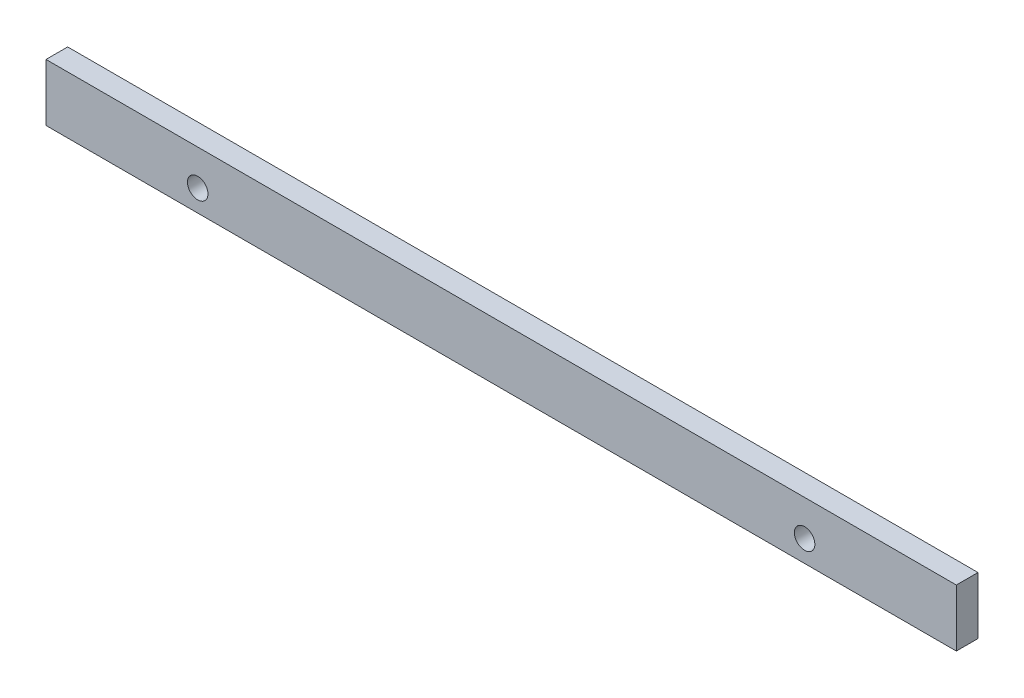
ISO-10303-21;
HEADER;
FILE_DESCRIPTION(('STEP AP214'),'2;1');
FILE_NAME('part.step','',(''),(''),'','','');
FILE_SCHEMA(('AUTOMOTIVE_DESIGN { 1 0 10303 214 1 1 1 1 }'));
ENDSEC;
DATA;
#1=APPLICATION_CONTEXT('core data for automotive mechanical design processes');
#2=APPLICATION_PROTOCOL_DEFINITION('international standard','automotive_design',2000,#1);
#3=PRODUCT_CONTEXT('',#1,'mechanical');
#4=PRODUCT('Part','Part','',(#3));
#5=PRODUCT_RELATED_PRODUCT_CATEGORY('part','',(#4));
#6=PRODUCT_DEFINITION_FORMATION('','',#4);
#7=PRODUCT_DEFINITION_CONTEXT('part definition',#1,'design');
#8=PRODUCT_DEFINITION('design','',#6,#7);
#9=PRODUCT_DEFINITION_SHAPE('','',#8);
#10=(LENGTH_UNIT() NAMED_UNIT(*) SI_UNIT(.MILLI.,.METRE.));
#11=(NAMED_UNIT(*) PLANE_ANGLE_UNIT() SI_UNIT($,.RADIAN.));
#12=(NAMED_UNIT(*) SI_UNIT($,.STERADIAN.) SOLID_ANGLE_UNIT());
#13=UNCERTAINTY_MEASURE_WITH_UNIT(LENGTH_MEASURE(1.E-05),#10,'distance_accuracy_value','');
#14=(GEOMETRIC_REPRESENTATION_CONTEXT(3) GLOBAL_UNCERTAINTY_ASSIGNED_CONTEXT((#13)) GLOBAL_UNIT_ASSIGNED_CONTEXT((#10,
#11,#12)) REPRESENTATION_CONTEXT('',''));
#15=CARTESIAN_POINT('',(0.,0.,0.));
#16=DIRECTION('',(0.,0.,1.));
#17=DIRECTION('',(1.,0.,0.));
#18=AXIS2_PLACEMENT_3D('',#15,#16,#17);
#19=CARTESIAN_POINT('',(0.,4.191,3.175));
#20=DIRECTION('',(0.,-1.,0.));
#21=DIRECTION('',(1.,0.,0.));
#22=AXIS2_PLACEMENT_3D('',#19,#20,#21);
#23=PLANE('',#22);
#24=DIRECTION('',(-1.,0.,0.));
#25=VECTOR('',#24,1.);
#26=CARTESIAN_POINT('',(0.,4.191,0.));
#27=LINE('',#26,#25);
#28=CARTESIAN_POINT('',(66.675,4.19100000000001,0.));
#29=VERTEX_POINT('',#28);
#30=CARTESIAN_POINT('',(-66.675,4.19099999999999,0.));
#31=VERTEX_POINT('',#30);
#32=EDGE_CURVE('E118',#29,#31,#27,.T.);
#33=ORIENTED_EDGE('',*,*,#32,.T.);
#34=DIRECTION('',(0.,0.,-1.));
#35=VECTOR('',#34,1.);
#36=CARTESIAN_POINT('',(-66.675,4.19099999999999,3.175));
#37=LINE('',#36,#35);
#38=CARTESIAN_POINT('',(-66.675,4.19099999999999,3.175));
#39=VERTEX_POINT('',#38);
#40=EDGE_CURVE('E11',#39,#31,#37,.T.);
#41=ORIENTED_EDGE('',*,*,#40,.F.);
#42=DIRECTION('',(-1.,0.,0.));
#43=VECTOR('',#42,1.);
#44=CARTESIAN_POINT('',(0.,4.191,3.175));
#45=LINE('',#44,#43);
#46=CARTESIAN_POINT('',(66.675,4.19100000000001,3.175));
#47=VERTEX_POINT('',#46);
#48=EDGE_CURVE('E92',#47,#39,#45,.T.);
#49=ORIENTED_EDGE('',*,*,#48,.F.);
#50=DIRECTION('',(0.,0.,-1.));
#51=VECTOR('',#50,1.);
#52=CARTESIAN_POINT('',(66.675,4.19100000000001,3.175));
#53=LINE('',#52,#51);
#54=EDGE_CURVE('E59',#47,#29,#53,.T.);
#55=ORIENTED_EDGE('',*,*,#54,.T.);
#56=EDGE_LOOP('',(#33,#41,#49,#55));
#57=FACE_BOUND('',#56,.T.);
#58=ADVANCED_FACE('F41',(#57),#23,.F.);
#59=CARTESIAN_POINT('',(-66.675,-1.10391493925797E-13,3.175));
#60=DIRECTION('',(1.,0.,0.));
#61=DIRECTION('',(0.,1.,0.));
#62=AXIS2_PLACEMENT_3D('',#59,#60,#61);
#63=PLANE('',#62);
#64=DIRECTION('',(0.,-1.,0.));
#65=VECTOR('',#64,1.);
#66=CARTESIAN_POINT('',(-66.675,-1.10391493925797E-13,0.));
#67=LINE('',#66,#65);
#68=CARTESIAN_POINT('',(-66.675,-4.19100000000001,0.));
#69=VERTEX_POINT('',#68);
#70=EDGE_CURVE('E98',#31,#69,#67,.T.);
#71=ORIENTED_EDGE('',*,*,#70,.T.);
#72=DIRECTION('',(0.,0.,-1.));
#73=VECTOR('',#72,1.);
#74=CARTESIAN_POINT('',(-66.675,-4.19100000000001,3.175));
#75=LINE('',#74,#73);
#76=CARTESIAN_POINT('',(-66.675,-4.19100000000001,3.175));
#77=VERTEX_POINT('',#76);
#78=EDGE_CURVE('E51',#77,#69,#75,.T.);
#79=ORIENTED_EDGE('',*,*,#78,.F.);
#80=DIRECTION('',(0.,-1.,0.));
#81=VECTOR('',#80,1.);
#82=CARTESIAN_POINT('',(-66.675,-1.10391493925797E-13,3.175));
#83=LINE('',#82,#81);
#84=EDGE_CURVE('E84',#39,#77,#83,.T.);
#85=ORIENTED_EDGE('',*,*,#84,.F.);
#86=ORIENTED_EDGE('',*,*,#40,.T.);
#87=EDGE_LOOP('',(#71,#79,#85,#86));
#88=FACE_BOUND('',#87,.T.);
#89=ADVANCED_FACE('F97',(#88),#63,.F.);
#90=CARTESIAN_POINT('',(0.,-4.191,3.175));
#91=DIRECTION('',(0.,-1.,0.));
#92=DIRECTION('',(1.,0.,0.));
#93=AXIS2_PLACEMENT_3D('',#90,#91,#92);
#94=PLANE('',#93);
#95=DIRECTION('',(-1.,0.,0.));
#96=VECTOR('',#95,1.);
#97=CARTESIAN_POINT('',(0.,-4.191,0.));
#98=LINE('',#97,#96);
#99=CARTESIAN_POINT('',(66.675,-4.19099999999999,0.));
#100=VERTEX_POINT('',#99);
#101=EDGE_CURVE('E123',#100,#69,#98,.T.);
#102=ORIENTED_EDGE('',*,*,#101,.F.);
#103=DIRECTION('',(0.,0.,-1.));
#104=VECTOR('',#103,1.);
#105=CARTESIAN_POINT('',(66.675,-4.19099999999999,3.175));
#106=LINE('',#105,#104);
#107=CARTESIAN_POINT('',(66.675,-4.19099999999999,3.175));
#108=VERTEX_POINT('',#107);
#109=EDGE_CURVE('E73',#108,#100,#106,.T.);
#110=ORIENTED_EDGE('',*,*,#109,.F.);
#111=DIRECTION('',(-1.,0.,0.));
#112=VECTOR('',#111,1.);
#113=CARTESIAN_POINT('',(0.,-4.191,3.175));
#114=LINE('',#113,#112);
#115=EDGE_CURVE('E91',#108,#77,#114,.T.);
#116=ORIENTED_EDGE('',*,*,#115,.T.);
#117=ORIENTED_EDGE('',*,*,#78,.T.);
#118=EDGE_LOOP('',(#102,#110,#116,#117));
#119=FACE_BOUND('',#118,.T.);
#120=ADVANCED_FACE('F102',(#119),#94,.T.);
#121=CARTESIAN_POINT('',(-44.45,-1.01600000000001,3.175));
#122=DIRECTION('',(0.,0.,-1.));
#123=DIRECTION('',(-1.,0.,0.));
#124=AXIS2_PLACEMENT_3D('',#121,#122,#123);
#125=CYLINDRICAL_SURFACE('',#124,1.5);
#126=CARTESIAN_POINT('',(-44.45,-1.01600000000001,3.175));
#127=DIRECTION('',(0.,0.,1.));
#128=DIRECTION('',(1.,0.,0.));
#129=AXIS2_PLACEMENT_3D('',#126,#127,#128);
#130=CIRCLE('',#129,1.5);
#131=CARTESIAN_POINT('',(-42.95,-1.01600000000001,3.175));
#132=VERTEX_POINT('',#131);
#133=EDGE_CURVE('E137',#132,#132,#130,.T.);
#134=ORIENTED_EDGE('',*,*,#133,.T.);
#135=EDGE_LOOP('',(#134));
#136=FACE_BOUND('',#135,.T.);
#137=CARTESIAN_POINT('',(-44.45,-1.01600000000001,0.));
#138=DIRECTION('',(0.,0.,1.));
#139=DIRECTION('',(1.,0.,0.));
#140=AXIS2_PLACEMENT_3D('',#137,#138,#139);
#141=CIRCLE('',#140,1.5);
#142=CARTESIAN_POINT('',(-42.95,-1.01600000000001,0.));
#143=VERTEX_POINT('',#142);
#144=EDGE_CURVE('E114',#143,#143,#141,.T.);
#145=ORIENTED_EDGE('',*,*,#144,.F.);
#146=EDGE_LOOP('',(#145));
#147=FACE_BOUND('',#146,.T.);
#148=ADVANCED_FACE('F147',(#136,#147),#125,.F.);
#149=CARTESIAN_POINT('',(44.45,-1.01600000000001,3.175));
#150=DIRECTION('',(0.,0.,-1.));
#151=DIRECTION('',(-1.,0.,0.));
#152=AXIS2_PLACEMENT_3D('',#149,#150,#151);
#153=CYLINDRICAL_SURFACE('',#152,1.5);
#154=CARTESIAN_POINT('',(44.45,-1.01600000000001,3.175));
#155=DIRECTION('',(0.,0.,1.));
#156=DIRECTION('',(1.,0.,0.));
#157=AXIS2_PLACEMENT_3D('',#154,#155,#156);
#158=CIRCLE('',#157,1.5);
#159=CARTESIAN_POINT('',(45.95,-1.01600000000001,3.175));
#160=VERTEX_POINT('',#159);
#161=EDGE_CURVE('E130',#160,#160,#158,.T.);
#162=ORIENTED_EDGE('',*,*,#161,.T.);
#163=EDGE_LOOP('',(#162));
#164=FACE_BOUND('',#163,.T.);
#165=CARTESIAN_POINT('',(44.45,-1.01600000000001,0.));
#166=DIRECTION('',(0.,0.,1.));
#167=DIRECTION('',(1.,0.,0.));
#168=AXIS2_PLACEMENT_3D('',#165,#166,#167);
#169=CIRCLE('',#168,1.5);
#170=CARTESIAN_POINT('',(45.95,-1.01600000000001,0.));
#171=VERTEX_POINT('',#170);
#172=EDGE_CURVE('E110',#171,#171,#169,.T.);
#173=ORIENTED_EDGE('',*,*,#172,.F.);
#174=EDGE_LOOP('',(#173));
#175=FACE_BOUND('',#174,.T.);
#176=ADVANCED_FACE('F43',(#164,#175),#153,.F.);
#177=CARTESIAN_POINT('',(66.675,0.,3.175));
#178=DIRECTION('',(1.,0.,0.));
#179=DIRECTION('',(0.,0.,-1.));
#180=AXIS2_PLACEMENT_3D('',#177,#178,#179);
#181=PLANE('',#180);
#182=DIRECTION('',(0.,-1.,0.));
#183=VECTOR('',#182,1.);
#184=CARTESIAN_POINT('',(66.675,0.,0.));
#185=LINE('',#184,#183);
#186=EDGE_CURVE('E126',#29,#100,#185,.T.);
#187=ORIENTED_EDGE('',*,*,#186,.F.);
#188=ORIENTED_EDGE('',*,*,#54,.F.);
#189=DIRECTION('',(0.,-1.,0.));
#190=VECTOR('',#189,1.);
#191=CARTESIAN_POINT('',(66.675,0.,3.175));
#192=LINE('',#191,#190);
#193=EDGE_CURVE('E104',#47,#108,#192,.T.);
#194=ORIENTED_EDGE('',*,*,#193,.T.);
#195=ORIENTED_EDGE('',*,*,#109,.T.);
#196=EDGE_LOOP('',(#187,#188,#194,#195));
#197=FACE_BOUND('',#196,.T.);
#198=ADVANCED_FACE('F152',(#197),#181,.T.);
#199=CARTESIAN_POINT('',(0.,0.,3.175));
#200=DIRECTION('',(0.,0.,1.));
#201=DIRECTION('',(1.,0.,0.));
#202=AXIS2_PLACEMENT_3D('',#199,#200,#201);
#203=PLANE('',#202);
#204=ORIENTED_EDGE('',*,*,#161,.F.);
#205=EDGE_LOOP('',(#204));
#206=FACE_BOUND('',#205,.T.);
#207=ORIENTED_EDGE('',*,*,#133,.F.);
#208=EDGE_LOOP('',(#207));
#209=FACE_BOUND('',#208,.T.);
#210=ORIENTED_EDGE('',*,*,#48,.T.);
#211=ORIENTED_EDGE('',*,*,#84,.T.);
#212=ORIENTED_EDGE('',*,*,#115,.F.);
#213=ORIENTED_EDGE('',*,*,#193,.F.);
#214=EDGE_LOOP('',(#210,#211,#212,#213));
#215=FACE_BOUND('',#214,.T.);
#216=ADVANCED_FACE('F88',(#206,#209,#215),#203,.T.);
#217=CARTESIAN_POINT('',(0.,0.,0.));
#218=DIRECTION('',(0.,0.,1.));
#219=DIRECTION('',(1.,0.,0.));
#220=AXIS2_PLACEMENT_3D('',#217,#218,#219);
#221=PLANE('',#220);
#222=ORIENTED_EDGE('',*,*,#172,.T.);
#223=EDGE_LOOP('',(#222));
#224=FACE_BOUND('',#223,.T.);
#225=ORIENTED_EDGE('',*,*,#144,.T.);
#226=EDGE_LOOP('',(#225));
#227=FACE_BOUND('',#226,.T.);
#228=ORIENTED_EDGE('',*,*,#32,.F.);
#229=ORIENTED_EDGE('',*,*,#186,.T.);
#230=ORIENTED_EDGE('',*,*,#101,.T.);
#231=ORIENTED_EDGE('',*,*,#70,.F.);
#232=EDGE_LOOP('',(#228,#229,#230,#231));
#233=FACE_BOUND('',#232,.T.);
#234=ADVANCED_FACE('F151',(#224,#227,#233),#221,.F.);
#235=CLOSED_SHELL('',(#58,#89,#120,#148,#176,#198,#216,#234));
#236=MANIFOLD_SOLID_BREP('B2',#235);
#237=ADVANCED_BREP_SHAPE_REPRESENTATION('',(#18,#236),#14);
#238=SHAPE_DEFINITION_REPRESENTATION(#9,#237);
ENDSEC;
END-ISO-10303-21;
